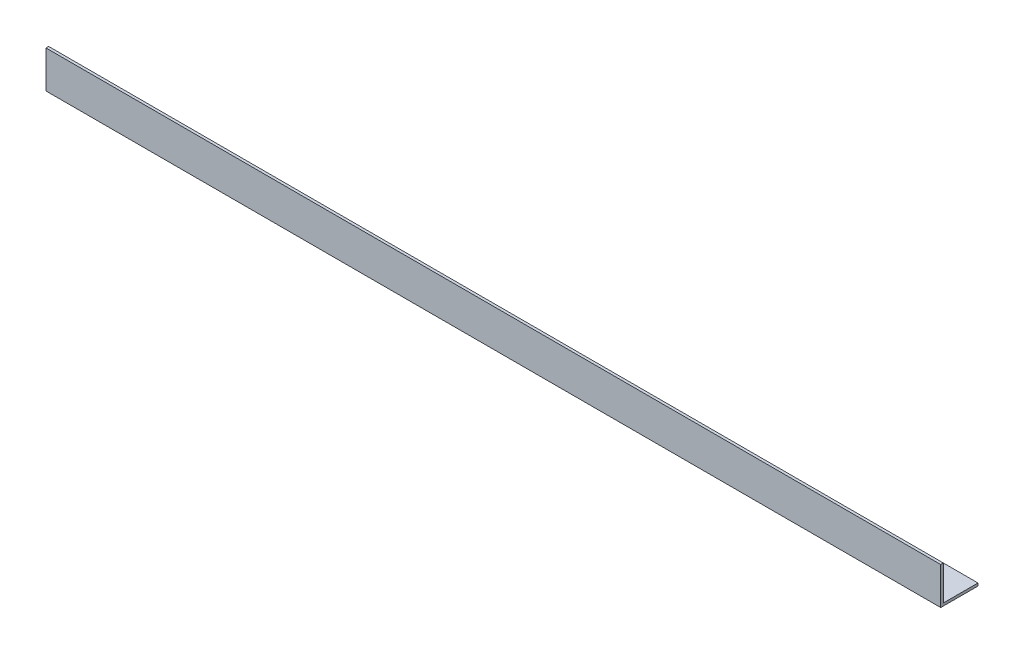
ISO-10303-21;
HEADER;
FILE_DESCRIPTION(('STEP AP214'),'2;1');
FILE_NAME('part.step','',(''),(''),'','','');
FILE_SCHEMA(('AUTOMOTIVE_DESIGN { 1 0 10303 214 1 1 1 1 }'));
ENDSEC;
DATA;
#1=APPLICATION_CONTEXT('core data for automotive mechanical design processes');
#2=APPLICATION_PROTOCOL_DEFINITION('international standard','automotive_design',2000,#1);
#3=PRODUCT_CONTEXT('',#1,'mechanical');
#4=PRODUCT('Part','Part','',(#3));
#5=PRODUCT_RELATED_PRODUCT_CATEGORY('part','',(#4));
#6=PRODUCT_DEFINITION_FORMATION('','',#4);
#7=PRODUCT_DEFINITION_CONTEXT('part definition',#1,'design');
#8=PRODUCT_DEFINITION('design','',#6,#7);
#9=PRODUCT_DEFINITION_SHAPE('','',#8);
#10=(LENGTH_UNIT() NAMED_UNIT(*) SI_UNIT(.MILLI.,.METRE.));
#11=(NAMED_UNIT(*) PLANE_ANGLE_UNIT() SI_UNIT($,.RADIAN.));
#12=(NAMED_UNIT(*) SI_UNIT($,.STERADIAN.) SOLID_ANGLE_UNIT());
#13=UNCERTAINTY_MEASURE_WITH_UNIT(LENGTH_MEASURE(1.E-05),#10,'distance_accuracy_value','');
#14=(GEOMETRIC_REPRESENTATION_CONTEXT(3) GLOBAL_UNCERTAINTY_ASSIGNED_CONTEXT((#13)) GLOBAL_UNIT_ASSIGNED_CONTEXT((#10,
#11,#12)) REPRESENTATION_CONTEXT('',''));
#15=CARTESIAN_POINT('',(0.,0.,0.));
#16=DIRECTION('',(0.,0.,1.));
#17=DIRECTION('',(1.,0.,0.));
#18=AXIS2_PLACEMENT_3D('',#15,#16,#17);
#19=CARTESIAN_POINT('',(1066.8,0.,-44.45));
#20=DIRECTION('',(0.,1.,0.));
#21=DIRECTION('',(0.,0.,1.));
#22=AXIS2_PLACEMENT_3D('',#19,#20,#21);
#23=PLANE('',#22);
#24=CARTESIAN_POINT('',(120.65,0.,-22.2249999999998));
#25=DIRECTION('',(0.,1.,0.));
#26=DIRECTION('',(0.,0.,1.));
#27=AXIS2_PLACEMENT_3D('',#24,#25,#26);
#28=CIRCLE('',#27,2.45745);
#29=CARTESIAN_POINT('',(120.65,0.,-19.7675499999998));
#30=VERTEX_POINT('',#29);
#31=EDGE_CURVE('E123',#30,#30,#28,.T.);
#32=ORIENTED_EDGE('',*,*,#31,.T.);
#33=EDGE_LOOP('',(#32));
#34=FACE_BOUND('',#33,.T.);
#35=CARTESIAN_POINT('',(395.81582,0.,-22.2249999999998));
#36=DIRECTION('',(0.,1.,0.));
#37=DIRECTION('',(0.,0.,1.));
#38=AXIS2_PLACEMENT_3D('',#35,#36,#37);
#39=CIRCLE('',#38,2.45745000000002);
#40=CARTESIAN_POINT('',(395.81582,0.,-19.7675499999998));
#41=VERTEX_POINT('',#40);
#42=EDGE_CURVE('E165',#41,#41,#39,.T.);
#43=ORIENTED_EDGE('',*,*,#42,.T.);
#44=EDGE_LOOP('',(#43));
#45=FACE_BOUND('',#44,.T.);
#46=CARTESIAN_POINT('',(670.98418,0.,-22.2249999999999));
#47=DIRECTION('',(0.,1.,0.));
#48=DIRECTION('',(0.,0.,1.));
#49=AXIS2_PLACEMENT_3D('',#46,#47,#48);
#50=CIRCLE('',#49,2.45745000000001);
#51=CARTESIAN_POINT('',(670.98418,0.,-19.7675499999999));
#52=VERTEX_POINT('',#51);
#53=EDGE_CURVE('E169',#52,#52,#50,.T.);
#54=ORIENTED_EDGE('',*,*,#53,.T.);
#55=EDGE_LOOP('',(#54));
#56=FACE_BOUND('',#55,.T.);
#57=CARTESIAN_POINT('',(946.15,0.,-22.2249999999999));
#58=DIRECTION('',(0.,1.,0.));
#59=DIRECTION('',(0.,0.,1.));
#60=AXIS2_PLACEMENT_3D('',#57,#58,#59);
#61=CIRCLE('',#60,2.45744999999989);
#62=CARTESIAN_POINT('',(946.15,0.,-19.76755));
#63=VERTEX_POINT('',#62);
#64=EDGE_CURVE('E172',#63,#63,#61,.T.);
#65=ORIENTED_EDGE('',*,*,#64,.T.);
#66=EDGE_LOOP('',(#65));
#67=FACE_BOUND('',#66,.T.);
#68=DIRECTION('',(0.,0.,-1.));
#69=VECTOR('',#68,1.);
#70=CARTESIAN_POINT('',(0.,0.,-44.45));
#71=LINE('',#70,#69);
#72=CARTESIAN_POINT('',(0.,0.,0.));
#73=VERTEX_POINT('',#72);
#74=CARTESIAN_POINT('',(0.,0.,-44.45));
#75=VERTEX_POINT('',#74);
#76=EDGE_CURVE('E119',#73,#75,#71,.T.);
#77=ORIENTED_EDGE('',*,*,#76,.T.);
#78=DIRECTION('',(-1.,0.,0.));
#79=VECTOR('',#78,1.);
#80=CARTESIAN_POINT('',(1066.8,0.,-44.45));
#81=LINE('',#80,#79);
#82=CARTESIAN_POINT('',(1066.8,0.,-44.45));
#83=VERTEX_POINT('',#82);
#84=EDGE_CURVE('E11',#83,#75,#81,.T.);
#85=ORIENTED_EDGE('',*,*,#84,.F.);
#86=DIRECTION('',(0.,0.,-1.));
#87=VECTOR('',#86,1.);
#88=CARTESIAN_POINT('',(1066.8,0.,-44.45));
#89=LINE('',#88,#87);
#90=CARTESIAN_POINT('',(1066.8,0.,0.));
#91=VERTEX_POINT('',#90);
#92=EDGE_CURVE('E130',#91,#83,#89,.T.);
#93=ORIENTED_EDGE('',*,*,#92,.F.);
#94=DIRECTION('',(-1.,0.,0.));
#95=VECTOR('',#94,1.);
#96=CARTESIAN_POINT('',(1066.8,0.,0.));
#97=LINE('',#96,#95);
#98=EDGE_CURVE('E115',#91,#73,#97,.T.);
#99=ORIENTED_EDGE('',*,*,#98,.T.);
#100=EDGE_LOOP('',(#77,#85,#93,#99));
#101=FACE_BOUND('',#100,.T.);
#102=ADVANCED_FACE('F35',(#34,#45,#56,#67,#101),#23,.F.);
#103=CARTESIAN_POINT('',(1066.8,3.17499999999999,-44.45));
#104=DIRECTION('',(0.,0.,1.));
#105=DIRECTION('',(1.,0.,0.));
#106=AXIS2_PLACEMENT_3D('',#103,#104,#105);
#107=PLANE('',#106);
#108=DIRECTION('',(0.,1.,0.));
#109=VECTOR('',#108,1.);
#110=CARTESIAN_POINT('',(0.,3.17499999999999,-44.45));
#111=LINE('',#110,#109);
#112=CARTESIAN_POINT('',(0.,3.17499999999999,-44.45));
#113=VERTEX_POINT('',#112);
#114=EDGE_CURVE('E122',#75,#113,#111,.T.);
#115=ORIENTED_EDGE('',*,*,#114,.T.);
#116=DIRECTION('',(-1.,0.,0.));
#117=VECTOR('',#116,1.);
#118=CARTESIAN_POINT('',(1066.8,3.17499999999999,-44.45));
#119=LINE('',#118,#117);
#120=CARTESIAN_POINT('',(1066.8,3.17499999999999,-44.45));
#121=VERTEX_POINT('',#120);
#122=EDGE_CURVE('E43',#121,#113,#119,.T.);
#123=ORIENTED_EDGE('',*,*,#122,.F.);
#124=DIRECTION('',(0.,1.,0.));
#125=VECTOR('',#124,1.);
#126=CARTESIAN_POINT('',(1066.8,3.17499999999999,-44.45));
#127=LINE('',#126,#125);
#128=EDGE_CURVE('E88',#83,#121,#127,.T.);
#129=ORIENTED_EDGE('',*,*,#128,.F.);
#130=ORIENTED_EDGE('',*,*,#84,.T.);
#131=EDGE_LOOP('',(#115,#123,#129,#130));
#132=FACE_BOUND('',#131,.T.);
#133=ADVANCED_FACE('F154',(#132),#107,.F.);
#134=CARTESIAN_POINT('',(1066.8,3.17499999999999,-3.17500000000001));
#135=DIRECTION('',(0.,-1.,0.));
#136=DIRECTION('',(0.,0.,-1.));
#137=AXIS2_PLACEMENT_3D('',#134,#135,#136);
#138=PLANE('',#137);
#139=CARTESIAN_POINT('',(120.65,3.17499999999999,-22.2249999999998));
#140=DIRECTION('',(0.,1.,0.));
#141=DIRECTION('',(0.,0.,1.));
#142=AXIS2_PLACEMENT_3D('',#139,#140,#141);
#143=CIRCLE('',#142,2.45745);
#144=CARTESIAN_POINT('',(120.65,3.17499999999999,-19.7675499999998));
#145=VERTEX_POINT('',#144);
#146=EDGE_CURVE('E174',#145,#145,#143,.T.);
#147=ORIENTED_EDGE('',*,*,#146,.F.);
#148=EDGE_LOOP('',(#147));
#149=FACE_BOUND('',#148,.T.);
#150=CARTESIAN_POINT('',(395.81582,3.17499999999999,-22.2249999999998));
#151=DIRECTION('',(0.,1.,0.));
#152=DIRECTION('',(0.,0.,1.));
#153=AXIS2_PLACEMENT_3D('',#150,#151,#152);
#154=CIRCLE('',#153,2.45745000000002);
#155=CARTESIAN_POINT('',(395.81582,3.17499999999999,-19.7675499999998));
#156=VERTEX_POINT('',#155);
#157=EDGE_CURVE('E178',#156,#156,#154,.T.);
#158=ORIENTED_EDGE('',*,*,#157,.F.);
#159=EDGE_LOOP('',(#158));
#160=FACE_BOUND('',#159,.T.);
#161=CARTESIAN_POINT('',(670.98418,3.17499999999999,-22.2249999999999));
#162=DIRECTION('',(0.,1.,0.));
#163=DIRECTION('',(0.,0.,-1.));
#164=AXIS2_PLACEMENT_3D('',#161,#162,#163);
#165=CIRCLE('',#164,2.45745000000001);
#166=CARTESIAN_POINT('',(670.98418,3.17499999999999,-24.6824499999999));
#167=VERTEX_POINT('',#166);
#168=EDGE_CURVE('E188',#167,#167,#165,.T.);
#169=ORIENTED_EDGE('',*,*,#168,.F.);
#170=EDGE_LOOP('',(#169));
#171=FACE_BOUND('',#170,.T.);
#172=CARTESIAN_POINT('',(946.15,3.17499999999999,-22.2249999999999));
#173=DIRECTION('',(0.,1.,0.));
#174=DIRECTION('',(0.,0.,-1.));
#175=AXIS2_PLACEMENT_3D('',#172,#173,#174);
#176=CIRCLE('',#175,2.45744999999989);
#177=CARTESIAN_POINT('',(946.15,3.17499999999999,-24.6824499999998));
#178=VERTEX_POINT('',#177);
#179=EDGE_CURVE('E181',#178,#178,#176,.T.);
#180=ORIENTED_EDGE('',*,*,#179,.F.);
#181=EDGE_LOOP('',(#180));
#182=FACE_BOUND('',#181,.T.);
#183=DIRECTION('',(0.,0.,1.));
#184=VECTOR('',#183,1.);
#185=CARTESIAN_POINT('',(0.,3.17499999999999,-3.17500000000001));
#186=LINE('',#185,#184);
#187=CARTESIAN_POINT('',(0.,3.17499999999999,-3.17500000000001));
#188=VERTEX_POINT('',#187);
#189=EDGE_CURVE('E125',#113,#188,#186,.T.);
#190=ORIENTED_EDGE('',*,*,#189,.T.);
#191=DIRECTION('',(-1.,0.,0.));
#192=VECTOR('',#191,1.);
#193=CARTESIAN_POINT('',(1066.8,3.17499999999999,-3.17500000000001));
#194=LINE('',#193,#192);
#195=CARTESIAN_POINT('',(1066.8,3.17499999999999,-3.17500000000001));
#196=VERTEX_POINT('',#195);
#197=EDGE_CURVE('E110',#196,#188,#194,.T.);
#198=ORIENTED_EDGE('',*,*,#197,.F.);
#199=DIRECTION('',(0.,0.,1.));
#200=VECTOR('',#199,1.);
#201=CARTESIAN_POINT('',(1066.8,3.17499999999999,-3.17500000000001));
#202=LINE('',#201,#200);
#203=EDGE_CURVE('E101',#121,#196,#202,.T.);
#204=ORIENTED_EDGE('',*,*,#203,.F.);
#205=ORIENTED_EDGE('',*,*,#122,.T.);
#206=EDGE_LOOP('',(#190,#198,#204,#205));
#207=FACE_BOUND('',#206,.T.);
#208=ADVANCED_FACE('F136',(#149,#160,#171,#182,#207),#138,.F.);
#209=CARTESIAN_POINT('',(1066.8,44.45,-3.175));
#210=DIRECTION('',(0.,0.,1.));
#211=DIRECTION('',(0.,-1.,0.));
#212=AXIS2_PLACEMENT_3D('',#209,#210,#211);
#213=PLANE('',#212);
#214=DIRECTION('',(0.,1.,0.));
#215=VECTOR('',#214,1.);
#216=CARTESIAN_POINT('',(0.,44.45,-3.175));
#217=LINE('',#216,#215);
#218=CARTESIAN_POINT('',(0.,44.45,-3.175));
#219=VERTEX_POINT('',#218);
#220=EDGE_CURVE('E109',#188,#219,#217,.T.);
#221=ORIENTED_EDGE('',*,*,#220,.T.);
#222=DIRECTION('',(-1.,0.,0.));
#223=VECTOR('',#222,1.);
#224=CARTESIAN_POINT('',(1066.8,44.45,-3.175));
#225=LINE('',#224,#223);
#226=CARTESIAN_POINT('',(1066.8,44.45,-3.175));
#227=VERTEX_POINT('',#226);
#228=EDGE_CURVE('E106',#227,#219,#225,.T.);
#229=ORIENTED_EDGE('',*,*,#228,.F.);
#230=DIRECTION('',(0.,1.,0.));
#231=VECTOR('',#230,1.);
#232=CARTESIAN_POINT('',(1066.8,44.45,-3.175));
#233=LINE('',#232,#231);
#234=EDGE_CURVE('E95',#196,#227,#233,.T.);
#235=ORIENTED_EDGE('',*,*,#234,.F.);
#236=ORIENTED_EDGE('',*,*,#197,.T.);
#237=EDGE_LOOP('',(#221,#229,#235,#236));
#238=FACE_BOUND('',#237,.T.);
#239=ADVANCED_FACE('F107',(#238),#213,.F.);
#240=CARTESIAN_POINT('',(1066.8,44.45,0.));
#241=DIRECTION('',(0.,-1.,0.));
#242=DIRECTION('',(0.,0.,-1.));
#243=AXIS2_PLACEMENT_3D('',#240,#241,#242);
#244=PLANE('',#243);
#245=DIRECTION('',(0.,0.,1.));
#246=VECTOR('',#245,1.);
#247=CARTESIAN_POINT('',(0.,44.45,0.));
#248=LINE('',#247,#246);
#249=CARTESIAN_POINT('',(0.,44.45,0.));
#250=VERTEX_POINT('',#249);
#251=EDGE_CURVE('E74',#219,#250,#248,.T.);
#252=ORIENTED_EDGE('',*,*,#251,.T.);
#253=DIRECTION('',(-1.,0.,0.));
#254=VECTOR('',#253,1.);
#255=CARTESIAN_POINT('',(1066.8,44.45,0.));
#256=LINE('',#255,#254);
#257=CARTESIAN_POINT('',(1066.8,44.45,0.));
#258=VERTEX_POINT('',#257);
#259=EDGE_CURVE('E111',#258,#250,#256,.T.);
#260=ORIENTED_EDGE('',*,*,#259,.F.);
#261=DIRECTION('',(0.,0.,1.));
#262=VECTOR('',#261,1.);
#263=CARTESIAN_POINT('',(1066.8,44.45,0.));
#264=LINE('',#263,#262);
#265=EDGE_CURVE('E99',#227,#258,#264,.T.);
#266=ORIENTED_EDGE('',*,*,#265,.F.);
#267=ORIENTED_EDGE('',*,*,#228,.T.);
#268=EDGE_LOOP('',(#252,#260,#266,#267));
#269=FACE_BOUND('',#268,.T.);
#270=ADVANCED_FACE('F113',(#269),#244,.F.);
#271=CARTESIAN_POINT('',(1066.8,0.,0.));
#272=DIRECTION('',(0.,0.,-1.));
#273=DIRECTION('',(-1.,0.,0.));
#274=AXIS2_PLACEMENT_3D('',#271,#272,#273);
#275=PLANE('',#274);
#276=DIRECTION('',(0.,-1.,0.));
#277=VECTOR('',#276,1.);
#278=CARTESIAN_POINT('',(0.,0.,0.));
#279=LINE('',#278,#277);
#280=EDGE_CURVE('E80',#250,#73,#279,.T.);
#281=ORIENTED_EDGE('',*,*,#280,.T.);
#282=ORIENTED_EDGE('',*,*,#98,.F.);
#283=DIRECTION('',(0.,-1.,0.));
#284=VECTOR('',#283,1.);
#285=CARTESIAN_POINT('',(1066.8,0.,0.));
#286=LINE('',#285,#284);
#287=EDGE_CURVE('E51',#258,#91,#286,.T.);
#288=ORIENTED_EDGE('',*,*,#287,.F.);
#289=ORIENTED_EDGE('',*,*,#259,.T.);
#290=EDGE_LOOP('',(#281,#282,#288,#289));
#291=FACE_BOUND('',#290,.T.);
#292=ADVANCED_FACE('F143',(#291),#275,.F.);
#293=CARTESIAN_POINT('',(1066.8,0.,0.));
#294=DIRECTION('',(-1.,0.,0.));
#295=DIRECTION('',(0.,0.,1.));
#296=AXIS2_PLACEMENT_3D('',#293,#294,#295);
#297=PLANE('',#296);
#298=ORIENTED_EDGE('',*,*,#92,.T.);
#299=ORIENTED_EDGE('',*,*,#128,.T.);
#300=ORIENTED_EDGE('',*,*,#203,.T.);
#301=ORIENTED_EDGE('',*,*,#234,.T.);
#302=ORIENTED_EDGE('',*,*,#265,.T.);
#303=ORIENTED_EDGE('',*,*,#287,.T.);
#304=EDGE_LOOP('',(#298,#299,#300,#301,#302,#303));
#305=FACE_BOUND('',#304,.T.);
#306=ADVANCED_FACE('F97',(#305),#297,.F.);
#307=CARTESIAN_POINT('',(0.,0.,0.));
#308=DIRECTION('',(-1.,0.,0.));
#309=DIRECTION('',(0.,0.,1.));
#310=AXIS2_PLACEMENT_3D('',#307,#308,#309);
#311=PLANE('',#310);
#312=ORIENTED_EDGE('',*,*,#76,.F.);
#313=ORIENTED_EDGE('',*,*,#280,.F.);
#314=ORIENTED_EDGE('',*,*,#251,.F.);
#315=ORIENTED_EDGE('',*,*,#220,.F.);
#316=ORIENTED_EDGE('',*,*,#189,.F.);
#317=ORIENTED_EDGE('',*,*,#114,.F.);
#318=EDGE_LOOP('',(#312,#313,#314,#315,#316,#317));
#319=FACE_BOUND('',#318,.T.);
#320=ADVANCED_FACE('F139',(#319),#311,.T.);
#321=CARTESIAN_POINT('',(946.15,-885.825,-22.2249999999999));
#322=DIRECTION('',(0.,1.,0.));
#323=DIRECTION('',(0.,0.,1.));
#324=AXIS2_PLACEMENT_3D('',#321,#322,#323);
#325=CYLINDRICAL_SURFACE('',#324,2.45744999999989);
#326=ORIENTED_EDGE('',*,*,#179,.T.);
#327=EDGE_LOOP('',(#326));
#328=FACE_BOUND('',#327,.T.);
#329=ORIENTED_EDGE('',*,*,#64,.F.);
#330=EDGE_LOOP('',(#329));
#331=FACE_BOUND('',#330,.T.);
#332=ADVANCED_FACE('F205',(#328,#331),#325,.F.);
#333=CARTESIAN_POINT('',(670.98418,-885.825,-22.2249999999998));
#334=DIRECTION('',(0.,1.,0.));
#335=DIRECTION('',(0.,0.,1.));
#336=AXIS2_PLACEMENT_3D('',#333,#334,#335);
#337=CYLINDRICAL_SURFACE('',#336,2.45745000000001);
#338=ORIENTED_EDGE('',*,*,#168,.T.);
#339=EDGE_LOOP('',(#338));
#340=FACE_BOUND('',#339,.T.);
#341=ORIENTED_EDGE('',*,*,#53,.F.);
#342=EDGE_LOOP('',(#341));
#343=FACE_BOUND('',#342,.T.);
#344=ADVANCED_FACE('F207',(#340,#343),#337,.F.);
#345=CARTESIAN_POINT('',(395.81582,-885.825,-22.2249999999998));
#346=DIRECTION('',(0.,1.,0.));
#347=DIRECTION('',(0.,0.,1.));
#348=AXIS2_PLACEMENT_3D('',#345,#346,#347);
#349=CYLINDRICAL_SURFACE('',#348,2.45745000000002);
#350=ORIENTED_EDGE('',*,*,#157,.T.);
#351=EDGE_LOOP('',(#350));
#352=FACE_BOUND('',#351,.T.);
#353=ORIENTED_EDGE('',*,*,#42,.F.);
#354=EDGE_LOOP('',(#353));
#355=FACE_BOUND('',#354,.T.);
#356=ADVANCED_FACE('F194',(#352,#355),#349,.F.);
#357=CARTESIAN_POINT('',(120.65,-885.825,-22.2249999999998));
#358=DIRECTION('',(0.,1.,0.));
#359=DIRECTION('',(0.,0.,1.));
#360=AXIS2_PLACEMENT_3D('',#357,#358,#359);
#361=CYLINDRICAL_SURFACE('',#360,2.45745);
#362=ORIENTED_EDGE('',*,*,#146,.T.);
#363=EDGE_LOOP('',(#362));
#364=FACE_BOUND('',#363,.T.);
#365=ORIENTED_EDGE('',*,*,#31,.F.);
#366=EDGE_LOOP('',(#365));
#367=FACE_BOUND('',#366,.T.);
#368=ADVANCED_FACE('F218',(#364,#367),#361,.F.);
#369=CLOSED_SHELL('',(#102,#133,#208,#239,#270,#292,#306,#320,#332,#344,#356,#368));
#370=MANIFOLD_SOLID_BREP('B2',#369);
#371=ADVANCED_BREP_SHAPE_REPRESENTATION('',(#18,#370),#14);
#372=SHAPE_DEFINITION_REPRESENTATION(#9,#371);
ENDSEC;
END-ISO-10303-21;
